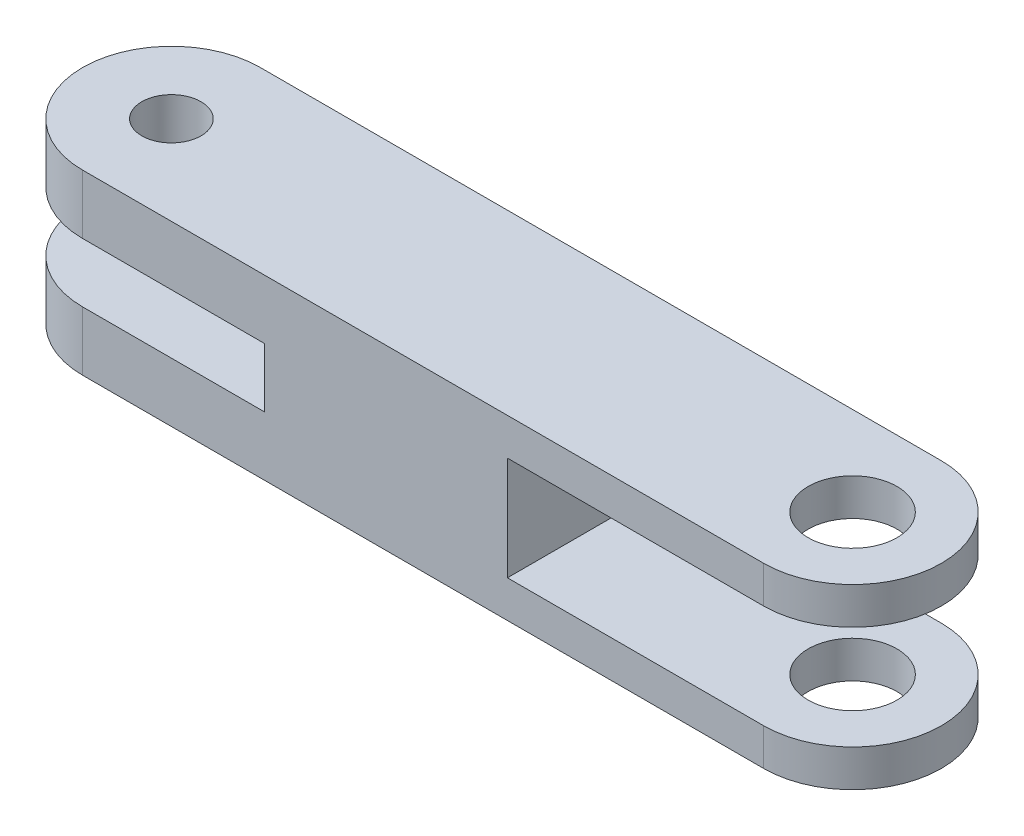
ISO-10303-21;
HEADER;
FILE_DESCRIPTION(('STEP AP214'),'2;1');
FILE_NAME('part.step','',(''),(''),'','','');
FILE_SCHEMA(('AUTOMOTIVE_DESIGN { 1 0 10303 214 1 1 1 1 }'));
ENDSEC;
DATA;
#1=APPLICATION_CONTEXT('core data for automotive mechanical design processes');
#2=APPLICATION_PROTOCOL_DEFINITION('international standard','automotive_design',2000,#1);
#3=PRODUCT_CONTEXT('',#1,'mechanical');
#4=PRODUCT('Part','Part','',(#3));
#5=PRODUCT_RELATED_PRODUCT_CATEGORY('part','',(#4));
#6=PRODUCT_DEFINITION_FORMATION('','',#4);
#7=PRODUCT_DEFINITION_CONTEXT('part definition',#1,'design');
#8=PRODUCT_DEFINITION('design','',#6,#7);
#9=PRODUCT_DEFINITION_SHAPE('','',#8);
#10=(LENGTH_UNIT() NAMED_UNIT(*) SI_UNIT(.MILLI.,.METRE.));
#11=(NAMED_UNIT(*) PLANE_ANGLE_UNIT() SI_UNIT($,.RADIAN.));
#12=(NAMED_UNIT(*) SI_UNIT($,.STERADIAN.) SOLID_ANGLE_UNIT());
#13=UNCERTAINTY_MEASURE_WITH_UNIT(LENGTH_MEASURE(1.E-05),#10,'distance_accuracy_value','');
#14=(GEOMETRIC_REPRESENTATION_CONTEXT(3) GLOBAL_UNCERTAINTY_ASSIGNED_CONTEXT((#13)) GLOBAL_UNIT_ASSIGNED_CONTEXT((#10,
#11,#12)) REPRESENTATION_CONTEXT('',''));
#15=CARTESIAN_POINT('',(0.,0.,0.));
#16=DIRECTION('',(0.,0.,1.));
#17=DIRECTION('',(1.,0.,0.));
#18=AXIS2_PLACEMENT_3D('',#15,#16,#17);
#19=CARTESIAN_POINT('',(0.,3.,0.));
#20=DIRECTION('',(0.,-1.,0.));
#21=DIRECTION('',(0.,0.,-1.));
#22=AXIS2_PLACEMENT_3D('',#19,#20,#21);
#23=CYLINDRICAL_SURFACE('',#22,3.);
#24=CARTESIAN_POINT('',(0.,1.,0.));
#25=DIRECTION('',(0.,-1.,0.));
#26=DIRECTION('',(0.,0.,-1.));
#27=AXIS2_PLACEMENT_3D('',#24,#25,#26);
#28=CIRCLE('',#27,3.);
#29=CARTESIAN_POINT('',(0.,1.,3.));
#30=VERTEX_POINT('',#29);
#31=CARTESIAN_POINT('',(0.,1.,-3.));
#32=VERTEX_POINT('',#31);
#33=EDGE_CURVE('E153',#30,#32,#28,.T.);
#34=ORIENTED_EDGE('',*,*,#33,.F.);
#35=DIRECTION('',(0.,-1.,0.));
#36=VECTOR('',#35,1.);
#37=CARTESIAN_POINT('',(0.,3.,3.));
#38=LINE('',#37,#36);
#39=CARTESIAN_POINT('',(0.,3.,3.));
#40=VERTEX_POINT('',#39);
#41=EDGE_CURVE('E148',#40,#30,#38,.T.);
#42=ORIENTED_EDGE('',*,*,#41,.F.);
#43=CARTESIAN_POINT('',(0.,3.,0.));
#44=DIRECTION('',(0.,1.,0.));
#45=DIRECTION('',(0.,0.,1.));
#46=AXIS2_PLACEMENT_3D('',#43,#44,#45);
#47=CIRCLE('',#46,3.);
#48=CARTESIAN_POINT('',(0.,3.,-3.));
#49=VERTEX_POINT('',#48);
#50=EDGE_CURVE('E200',#49,#40,#47,.T.);
#51=ORIENTED_EDGE('',*,*,#50,.F.);
#52=DIRECTION('',(0.,-1.,0.));
#53=VECTOR('',#52,1.);
#54=CARTESIAN_POINT('',(0.,3.,-3.));
#55=LINE('',#54,#53);
#56=EDGE_CURVE('E221',#49,#32,#55,.T.);
#57=ORIENTED_EDGE('',*,*,#56,.T.);
#58=EDGE_LOOP('',(#34,#42,#51,#57));
#59=FACE_BOUND('',#58,.T.);
#60=ADVANCED_FACE('F41',(#59),#23,.T.);
#61=CARTESIAN_POINT('',(0.,3.,0.));
#62=DIRECTION('',(0.,-1.,0.));
#63=DIRECTION('',(0.,0.,-1.));
#64=AXIS2_PLACEMENT_3D('',#61,#62,#63);
#65=CYLINDRICAL_SURFACE('',#64,1.);
#66=CARTESIAN_POINT('',(0.,3.,0.));
#67=DIRECTION('',(0.,1.,0.));
#68=DIRECTION('',(0.,0.,1.));
#69=AXIS2_PLACEMENT_3D('',#66,#67,#68);
#70=CIRCLE('',#69,1.);
#71=CARTESIAN_POINT('',(0.,3.,1.));
#72=VERTEX_POINT('',#71);
#73=EDGE_CURVE('E188',#72,#72,#70,.T.);
#74=ORIENTED_EDGE('',*,*,#73,.T.);
#75=EDGE_LOOP('',(#74));
#76=FACE_BOUND('',#75,.T.);
#77=CARTESIAN_POINT('',(0.,1.,0.));
#78=DIRECTION('',(0.,-1.,0.));
#79=DIRECTION('',(0.,0.,-1.));
#80=AXIS2_PLACEMENT_3D('',#77,#78,#79);
#81=CIRCLE('',#80,1.);
#82=CARTESIAN_POINT('',(0.,1.,-1.));
#83=VERTEX_POINT('',#82);
#84=EDGE_CURVE('E240',#83,#83,#81,.T.);
#85=ORIENTED_EDGE('',*,*,#84,.T.);
#86=EDGE_LOOP('',(#85));
#87=FACE_BOUND('',#86,.T.);
#88=ADVANCED_FACE('F285',(#76,#87),#65,.F.);
#89=CARTESIAN_POINT('',(0.,3.,3.));
#90=DIRECTION('',(0.,0.,-1.));
#91=DIRECTION('',(-1.,0.,0.));
#92=AXIS2_PLACEMENT_3D('',#89,#90,#91);
#93=PLANE('',#92);
#94=DIRECTION('',(0.,-1.,0.));
#95=VECTOR('',#94,1.);
#96=CARTESIAN_POINT('',(6.13903412950462,3.,3.));
#97=LINE('',#96,#95);
#98=CARTESIAN_POINT('',(6.13903412950462,1.,3.));
#99=VERTEX_POINT('',#98);
#100=CARTESIAN_POINT('',(6.13903412950462,-1.,3.));
#101=VERTEX_POINT('',#100);
#102=EDGE_CURVE('E132',#99,#101,#97,.T.);
#103=ORIENTED_EDGE('',*,*,#102,.T.);
#104=DIRECTION('',(-1.,0.,0.));
#105=VECTOR('',#104,1.);
#106=CARTESIAN_POINT('',(0.,-1.,3.));
#107=LINE('',#106,#105);
#108=CARTESIAN_POINT('',(0.,-1.,3.));
#109=VERTEX_POINT('',#108);
#110=EDGE_CURVE('E139',#101,#109,#107,.T.);
#111=ORIENTED_EDGE('',*,*,#110,.T.);
#112=CARTESIAN_POINT('',(0.,-3.,3.));
#113=VERTEX_POINT('',#112);
#114=EDGE_CURVE('E232',#109,#113,#38,.T.);
#115=ORIENTED_EDGE('',*,*,#114,.T.);
#116=DIRECTION('',(1.,0.,0.));
#117=VECTOR('',#116,1.);
#118=CARTESIAN_POINT('',(0.,-3.,3.));
#119=LINE('',#118,#117);
#120=CARTESIAN_POINT('',(23.,-3.,3.));
#121=VERTEX_POINT('',#120);
#122=EDGE_CURVE('E213',#113,#121,#119,.T.);
#123=ORIENTED_EDGE('',*,*,#122,.T.);
#124=DIRECTION('',(0.,-1.,0.));
#125=VECTOR('',#124,1.);
#126=CARTESIAN_POINT('',(23.,3.,3.));
#127=LINE('',#126,#125);
#128=CARTESIAN_POINT('',(23.,-1.75,3.));
#129=VERTEX_POINT('',#128);
#130=EDGE_CURVE('E228',#129,#121,#127,.T.);
#131=ORIENTED_EDGE('',*,*,#130,.F.);
#132=DIRECTION('',(1.,0.,0.));
#133=VECTOR('',#132,1.);
#134=CARTESIAN_POINT('',(0.,-1.75,3.));
#135=LINE('',#134,#133);
#136=CARTESIAN_POINT('',(14.3461409194115,-1.75,3.));
#137=VERTEX_POINT('',#136);
#138=EDGE_CURVE('E182',#137,#129,#135,.T.);
#139=ORIENTED_EDGE('',*,*,#138,.F.);
#140=DIRECTION('',(0.,1.,0.));
#141=VECTOR('',#140,1.);
#142=CARTESIAN_POINT('',(14.3461409194115,3.,3.));
#143=LINE('',#142,#141);
#144=CARTESIAN_POINT('',(14.3461409194115,1.75,3.));
#145=VERTEX_POINT('',#144);
#146=EDGE_CURVE('E184',#137,#145,#143,.T.);
#147=ORIENTED_EDGE('',*,*,#146,.T.);
#148=DIRECTION('',(1.,0.,0.));
#149=VECTOR('',#148,1.);
#150=CARTESIAN_POINT('',(0.,1.75,3.));
#151=LINE('',#150,#149);
#152=CARTESIAN_POINT('',(23.,1.75,3.));
#153=VERTEX_POINT('',#152);
#154=EDGE_CURVE('E174',#145,#153,#151,.T.);
#155=ORIENTED_EDGE('',*,*,#154,.T.);
#156=CARTESIAN_POINT('',(23.,3.,3.));
#157=VERTEX_POINT('',#156);
#158=EDGE_CURVE('E229',#157,#153,#127,.T.);
#159=ORIENTED_EDGE('',*,*,#158,.F.);
#160=DIRECTION('',(1.,0.,0.));
#161=VECTOR('',#160,1.);
#162=CARTESIAN_POINT('',(0.,3.,3.));
#163=LINE('',#162,#161);
#164=EDGE_CURVE('E203',#40,#157,#163,.T.);
#165=ORIENTED_EDGE('',*,*,#164,.F.);
#166=ORIENTED_EDGE('',*,*,#41,.T.);
#167=DIRECTION('',(-1.,0.,0.));
#168=VECTOR('',#167,1.);
#169=CARTESIAN_POINT('',(0.,1.,3.));
#170=LINE('',#169,#168);
#171=EDGE_CURVE('E56',#99,#30,#170,.T.);
#172=ORIENTED_EDGE('',*,*,#171,.F.);
#173=EDGE_LOOP('',(#103,#111,#115,#123,#131,#139,#147,#155,#159,#165,#166,#172));
#174=FACE_BOUND('',#173,.T.);
#175=ADVANCED_FACE('F146',(#174),#93,.F.);
#176=CARTESIAN_POINT('',(23.,3.,0.));
#177=DIRECTION('',(0.,-1.,0.));
#178=DIRECTION('',(0.,0.,-1.));
#179=AXIS2_PLACEMENT_3D('',#176,#177,#178);
#180=CYLINDRICAL_SURFACE('',#179,3.);
#181=CARTESIAN_POINT('',(23.,-1.75,0.));
#182=DIRECTION('',(0.,1.,0.));
#183=DIRECTION('',(0.,0.,1.));
#184=AXIS2_PLACEMENT_3D('',#181,#182,#183);
#185=CIRCLE('',#184,3.);
#186=CARTESIAN_POINT('',(23.,-1.75,-3.));
#187=VERTEX_POINT('',#186);
#188=EDGE_CURVE('E180',#129,#187,#185,.T.);
#189=ORIENTED_EDGE('',*,*,#188,.F.);
#190=ORIENTED_EDGE('',*,*,#130,.T.);
#191=CARTESIAN_POINT('',(23.,-3.,0.));
#192=DIRECTION('',(0.,1.,0.));
#193=DIRECTION('',(0.,0.,1.));
#194=AXIS2_PLACEMENT_3D('',#191,#192,#193);
#195=CIRCLE('',#194,3.);
#196=CARTESIAN_POINT('',(23.,-3.,-3.));
#197=VERTEX_POINT('',#196);
#198=EDGE_CURVE('E216',#121,#197,#195,.T.);
#199=ORIENTED_EDGE('',*,*,#198,.T.);
#200=DIRECTION('',(0.,-1.,0.));
#201=VECTOR('',#200,1.);
#202=CARTESIAN_POINT('',(23.,3.,-3.));
#203=LINE('',#202,#201);
#204=EDGE_CURVE('E224',#187,#197,#203,.T.);
#205=ORIENTED_EDGE('',*,*,#204,.F.);
#206=EDGE_LOOP('',(#189,#190,#199,#205));
#207=FACE_BOUND('',#206,.T.);
#208=ADVANCED_FACE('F263',(#207),#180,.T.);
#209=CARTESIAN_POINT('',(0.,3.,-3.));
#210=DIRECTION('',(0.,0.,1.));
#211=DIRECTION('',(1.,0.,0.));
#212=AXIS2_PLACEMENT_3D('',#209,#210,#211);
#213=PLANE('',#212);
#214=CARTESIAN_POINT('',(0.,-1.,-3.));
#215=VERTEX_POINT('',#214);
#216=CARTESIAN_POINT('',(0.,-3.,-3.));
#217=VERTEX_POINT('',#216);
#218=EDGE_CURVE('E210',#215,#217,#55,.T.);
#219=ORIENTED_EDGE('',*,*,#218,.F.);
#220=DIRECTION('',(1.,0.,0.));
#221=VECTOR('',#220,1.);
#222=CARTESIAN_POINT('',(0.,-1.,-3.));
#223=LINE('',#222,#221);
#224=CARTESIAN_POINT('',(6.13903412950462,-1.,-3.));
#225=VERTEX_POINT('',#224);
#226=EDGE_CURVE('E159',#215,#225,#223,.T.);
#227=ORIENTED_EDGE('',*,*,#226,.T.);
#228=DIRECTION('',(0.,1.,0.));
#229=VECTOR('',#228,1.);
#230=CARTESIAN_POINT('',(6.13903412950462,3.,-3.));
#231=LINE('',#230,#229);
#232=CARTESIAN_POINT('',(6.13903412950462,1.,-3.));
#233=VERTEX_POINT('',#232);
#234=EDGE_CURVE('E11',#225,#233,#231,.T.);
#235=ORIENTED_EDGE('',*,*,#234,.T.);
#236=DIRECTION('',(1.,0.,0.));
#237=VECTOR('',#236,1.);
#238=CARTESIAN_POINT('',(0.,1.,-3.));
#239=LINE('',#238,#237);
#240=EDGE_CURVE('E143',#32,#233,#239,.T.);
#241=ORIENTED_EDGE('',*,*,#240,.F.);
#242=ORIENTED_EDGE('',*,*,#56,.F.);
#243=DIRECTION('',(-1.,0.,0.));
#244=VECTOR('',#243,1.);
#245=CARTESIAN_POINT('',(0.,3.,-3.));
#246=LINE('',#245,#244);
#247=CARTESIAN_POINT('',(23.,3.,-3.));
#248=VERTEX_POINT('',#247);
#249=EDGE_CURVE('E208',#248,#49,#246,.T.);
#250=ORIENTED_EDGE('',*,*,#249,.F.);
#251=CARTESIAN_POINT('',(23.,1.75,-3.));
#252=VERTEX_POINT('',#251);
#253=EDGE_CURVE('E225',#248,#252,#203,.T.);
#254=ORIENTED_EDGE('',*,*,#253,.T.);
#255=DIRECTION('',(-1.,0.,0.));
#256=VECTOR('',#255,1.);
#257=CARTESIAN_POINT('',(0.,1.75,-3.));
#258=LINE('',#257,#256);
#259=CARTESIAN_POINT('',(14.3461409194115,1.75,-3.));
#260=VERTEX_POINT('',#259);
#261=EDGE_CURVE('E168',#252,#260,#258,.T.);
#262=ORIENTED_EDGE('',*,*,#261,.T.);
#263=DIRECTION('',(0.,-1.,0.));
#264=VECTOR('',#263,1.);
#265=CARTESIAN_POINT('',(14.3461409194115,3.,-3.));
#266=LINE('',#265,#264);
#267=CARTESIAN_POINT('',(14.3461409194115,-1.75,-3.));
#268=VERTEX_POINT('',#267);
#269=EDGE_CURVE('E49',#260,#268,#266,.T.);
#270=ORIENTED_EDGE('',*,*,#269,.T.);
#271=DIRECTION('',(-1.,0.,0.));
#272=VECTOR('',#271,1.);
#273=CARTESIAN_POINT('',(0.,-1.75,-3.));
#274=LINE('',#273,#272);
#275=EDGE_CURVE('E178',#187,#268,#274,.T.);
#276=ORIENTED_EDGE('',*,*,#275,.F.);
#277=ORIENTED_EDGE('',*,*,#204,.T.);
#278=DIRECTION('',(-1.,0.,0.));
#279=VECTOR('',#278,1.);
#280=CARTESIAN_POINT('',(0.,-3.,-3.));
#281=LINE('',#280,#279);
#282=EDGE_CURVE('E204',#197,#217,#281,.T.);
#283=ORIENTED_EDGE('',*,*,#282,.T.);
#284=EDGE_LOOP('',(#219,#227,#235,#241,#242,#250,#254,#262,#270,#276,#277,#283));
#285=FACE_BOUND('',#284,.T.);
#286=ADVANCED_FACE('F249',(#285),#213,.F.);
#287=CARTESIAN_POINT('',(23.,3.,0.));
#288=DIRECTION('',(0.,-1.,0.));
#289=DIRECTION('',(0.,0.,-1.));
#290=AXIS2_PLACEMENT_3D('',#287,#288,#289);
#291=CYLINDRICAL_SURFACE('',#290,1.5);
#292=CARTESIAN_POINT('',(23.,-3.,0.));
#293=DIRECTION('',(0.,1.,0.));
#294=DIRECTION('',(0.,0.,1.));
#295=AXIS2_PLACEMENT_3D('',#292,#293,#294);
#296=CIRCLE('',#295,1.5);
#297=CARTESIAN_POINT('',(23.,-3.,1.5));
#298=VERTEX_POINT('',#297);
#299=EDGE_CURVE('E191',#298,#298,#296,.T.);
#300=ORIENTED_EDGE('',*,*,#299,.F.);
#301=EDGE_LOOP('',(#300));
#302=FACE_BOUND('',#301,.T.);
#303=CARTESIAN_POINT('',(23.,-1.75,0.));
#304=DIRECTION('',(0.,1.,0.));
#305=DIRECTION('',(0.,0.,1.));
#306=AXIS2_PLACEMENT_3D('',#303,#304,#305);
#307=CIRCLE('',#306,1.5);
#308=CARTESIAN_POINT('',(23.,-1.75,1.5));
#309=VERTEX_POINT('',#308);
#310=EDGE_CURVE('E177',#309,#309,#307,.T.);
#311=ORIENTED_EDGE('',*,*,#310,.T.);
#312=EDGE_LOOP('',(#311));
#313=FACE_BOUND('',#312,.T.);
#314=ADVANCED_FACE('F307',(#302,#313),#291,.F.);
#315=CARTESIAN_POINT('',(0.,3.,0.));
#316=DIRECTION('',(0.,1.,0.));
#317=DIRECTION('',(0.,0.,1.));
#318=AXIS2_PLACEMENT_3D('',#315,#316,#317);
#319=PLANE('',#318);
#320=CARTESIAN_POINT('',(23.,3.,0.));
#321=DIRECTION('',(0.,1.,0.));
#322=DIRECTION('',(0.,0.,1.));
#323=AXIS2_PLACEMENT_3D('',#320,#321,#322);
#324=CIRCLE('',#323,1.5);
#325=CARTESIAN_POINT('',(23.,3.,1.5));
#326=VERTEX_POINT('',#325);
#327=EDGE_CURVE('E194',#326,#326,#324,.T.);
#328=ORIENTED_EDGE('',*,*,#327,.F.);
#329=EDGE_LOOP('',(#328));
#330=FACE_BOUND('',#329,.T.);
#331=ORIENTED_EDGE('',*,*,#50,.T.);
#332=ORIENTED_EDGE('',*,*,#164,.T.);
#333=CARTESIAN_POINT('',(23.,3.,0.));
#334=DIRECTION('',(0.,1.,0.));
#335=DIRECTION('',(0.,0.,1.));
#336=AXIS2_PLACEMENT_3D('',#333,#334,#335);
#337=CIRCLE('',#336,3.);
#338=EDGE_CURVE('E206',#157,#248,#337,.T.);
#339=ORIENTED_EDGE('',*,*,#338,.T.);
#340=ORIENTED_EDGE('',*,*,#249,.T.);
#341=EDGE_LOOP('',(#331,#332,#339,#340));
#342=FACE_BOUND('',#341,.T.);
#343=ORIENTED_EDGE('',*,*,#73,.F.);
#344=EDGE_LOOP('',(#343));
#345=FACE_BOUND('',#344,.T.);
#346=ADVANCED_FACE('F280',(#330,#342,#345),#319,.T.);
#347=CARTESIAN_POINT('',(0.,-3.,0.));
#348=DIRECTION('',(0.,1.,0.));
#349=DIRECTION('',(0.,0.,1.));
#350=AXIS2_PLACEMENT_3D('',#347,#348,#349);
#351=PLANE('',#350);
#352=CARTESIAN_POINT('',(0.,-3.,0.));
#353=DIRECTION('',(0.,1.,0.));
#354=DIRECTION('',(0.,0.,1.));
#355=AXIS2_PLACEMENT_3D('',#352,#353,#354);
#356=CIRCLE('',#355,3.);
#357=EDGE_CURVE('E197',#217,#113,#356,.T.);
#358=ORIENTED_EDGE('',*,*,#357,.F.);
#359=ORIENTED_EDGE('',*,*,#282,.F.);
#360=ORIENTED_EDGE('',*,*,#198,.F.);
#361=ORIENTED_EDGE('',*,*,#122,.F.);
#362=EDGE_LOOP('',(#358,#359,#360,#361));
#363=FACE_BOUND('',#362,.T.);
#364=ORIENTED_EDGE('',*,*,#299,.T.);
#365=EDGE_LOOP('',(#364));
#366=FACE_BOUND('',#365,.T.);
#367=CARTESIAN_POINT('',(0.,-3.,0.));
#368=DIRECTION('',(0.,1.,0.));
#369=DIRECTION('',(0.,0.,1.));
#370=AXIS2_PLACEMENT_3D('',#367,#368,#369);
#371=CIRCLE('',#370,1.);
#372=CARTESIAN_POINT('',(0.,-3.,1.));
#373=VERTEX_POINT('',#372);
#374=EDGE_CURVE('E187',#373,#373,#371,.T.);
#375=ORIENTED_EDGE('',*,*,#374,.T.);
#376=EDGE_LOOP('',(#375));
#377=FACE_BOUND('',#376,.T.);
#378=ADVANCED_FACE('F258',(#363,#366,#377),#351,.F.);
#379=ORIENTED_EDGE('',*,*,#114,.F.);
#380=CARTESIAN_POINT('',(0.,-1.,0.));
#381=DIRECTION('',(0.,-1.,0.));
#382=DIRECTION('',(0.,0.,-1.));
#383=AXIS2_PLACEMENT_3D('',#380,#381,#382);
#384=CIRCLE('',#383,3.);
#385=EDGE_CURVE('E152',#109,#215,#384,.T.);
#386=ORIENTED_EDGE('',*,*,#385,.T.);
#387=ORIENTED_EDGE('',*,*,#218,.T.);
#388=ORIENTED_EDGE('',*,*,#357,.T.);
#389=EDGE_LOOP('',(#379,#386,#387,#388));
#390=FACE_BOUND('',#389,.T.);
#391=ADVANCED_FACE('F43',(#390),#23,.T.);
#392=ORIENTED_EDGE('',*,*,#158,.T.);
#393=CARTESIAN_POINT('',(23.,1.75,0.));
#394=DIRECTION('',(0.,1.,0.));
#395=DIRECTION('',(0.,0.,1.));
#396=AXIS2_PLACEMENT_3D('',#393,#394,#395);
#397=CIRCLE('',#396,3.);
#398=EDGE_CURVE('E171',#153,#252,#397,.T.);
#399=ORIENTED_EDGE('',*,*,#398,.T.);
#400=ORIENTED_EDGE('',*,*,#253,.F.);
#401=ORIENTED_EDGE('',*,*,#338,.F.);
#402=EDGE_LOOP('',(#392,#399,#400,#401));
#403=FACE_BOUND('',#402,.T.);
#404=ADVANCED_FACE('F275',(#403),#180,.T.);
#405=CARTESIAN_POINT('',(23.,1.75,0.));
#406=DIRECTION('',(0.,1.,0.));
#407=DIRECTION('',(0.,0.,1.));
#408=AXIS2_PLACEMENT_3D('',#405,#406,#407);
#409=CIRCLE('',#408,1.5);
#410=CARTESIAN_POINT('',(23.,1.75,1.5));
#411=VERTEX_POINT('',#410);
#412=EDGE_CURVE('E166',#411,#411,#409,.T.);
#413=ORIENTED_EDGE('',*,*,#412,.F.);
#414=EDGE_LOOP('',(#413));
#415=FACE_BOUND('',#414,.T.);
#416=ORIENTED_EDGE('',*,*,#327,.T.);
#417=EDGE_LOOP('',(#416));
#418=FACE_BOUND('',#417,.T.);
#419=ADVANCED_FACE('F299',(#415,#418),#291,.F.);
#420=CARTESIAN_POINT('',(0.,-1.,0.));
#421=DIRECTION('',(0.,-1.,0.));
#422=DIRECTION('',(0.,0.,-1.));
#423=AXIS2_PLACEMENT_3D('',#420,#421,#422);
#424=CIRCLE('',#423,1.);
#425=CARTESIAN_POINT('',(0.,-1.,-1.));
#426=VERTEX_POINT('',#425);
#427=EDGE_CURVE('E149',#426,#426,#424,.T.);
#428=ORIENTED_EDGE('',*,*,#427,.F.);
#429=EDGE_LOOP('',(#428));
#430=FACE_BOUND('',#429,.T.);
#431=ORIENTED_EDGE('',*,*,#374,.F.);
#432=EDGE_LOOP('',(#431));
#433=FACE_BOUND('',#432,.T.);
#434=ADVANCED_FACE('F292',(#430,#433),#65,.F.);
#435=CARTESIAN_POINT('',(14.3461409194115,-1.75,-7.84320747138726));
#436=DIRECTION('',(-1.,0.,0.));
#437=DIRECTION('',(0.,0.,1.));
#438=AXIS2_PLACEMENT_3D('',#435,#436,#437);
#439=PLANE('',#438);
#440=DIRECTION('',(0.,0.,1.));
#441=VECTOR('',#440,1.);
#442=CARTESIAN_POINT('',(14.3461409194115,-1.75,-7.84320747138726));
#443=LINE('',#442,#441);
#444=EDGE_CURVE('E163',#268,#137,#443,.T.);
#445=ORIENTED_EDGE('',*,*,#444,.F.);
#446=ORIENTED_EDGE('',*,*,#269,.F.);
#447=DIRECTION('',(0.,0.,1.));
#448=VECTOR('',#447,1.);
#449=CARTESIAN_POINT('',(14.3461409194115,1.75,-7.84320747138726));
#450=LINE('',#449,#448);
#451=EDGE_CURVE('E64',#260,#145,#450,.T.);
#452=ORIENTED_EDGE('',*,*,#451,.T.);
#453=ORIENTED_EDGE('',*,*,#146,.F.);
#454=EDGE_LOOP('',(#445,#446,#452,#453));
#455=FACE_BOUND('',#454,.T.);
#456=ADVANCED_FACE('F270',(#455),#439,.F.);
#457=CARTESIAN_POINT('',(0.,-1.75,0.));
#458=DIRECTION('',(0.,1.,0.));
#459=DIRECTION('',(0.,0.,1.));
#460=AXIS2_PLACEMENT_3D('',#457,#458,#459);
#461=PLANE('',#460);
#462=ORIENTED_EDGE('',*,*,#310,.F.);
#463=EDGE_LOOP('',(#462));
#464=FACE_BOUND('',#463,.T.);
#465=ORIENTED_EDGE('',*,*,#138,.T.);
#466=ORIENTED_EDGE('',*,*,#188,.T.);
#467=ORIENTED_EDGE('',*,*,#275,.T.);
#468=ORIENTED_EDGE('',*,*,#444,.T.);
#469=EDGE_LOOP('',(#465,#466,#467,#468));
#470=FACE_BOUND('',#469,.T.);
#471=ADVANCED_FACE('F266',(#464,#470),#461,.T.);
#472=CARTESIAN_POINT('',(0.,1.75,0.));
#473=DIRECTION('',(0.,1.,0.));
#474=DIRECTION('',(0.,0.,1.));
#475=AXIS2_PLACEMENT_3D('',#472,#473,#474);
#476=PLANE('',#475);
#477=ORIENTED_EDGE('',*,*,#412,.T.);
#478=EDGE_LOOP('',(#477));
#479=FACE_BOUND('',#478,.T.);
#480=ORIENTED_EDGE('',*,*,#451,.F.);
#481=ORIENTED_EDGE('',*,*,#261,.F.);
#482=ORIENTED_EDGE('',*,*,#398,.F.);
#483=ORIENTED_EDGE('',*,*,#154,.F.);
#484=EDGE_LOOP('',(#480,#481,#482,#483));
#485=FACE_BOUND('',#484,.T.);
#486=ADVANCED_FACE('F273',(#479,#485),#476,.F.);
#487=CARTESIAN_POINT('',(6.13903412950462,-1.,-5.03584344586886));
#488=DIRECTION('',(1.,0.,0.));
#489=DIRECTION('',(0.,0.,-1.));
#490=AXIS2_PLACEMENT_3D('',#487,#488,#489);
#491=PLANE('',#490);
#492=DIRECTION('',(0.,0.,-1.));
#493=VECTOR('',#492,1.);
#494=CARTESIAN_POINT('',(6.13903412950462,1.,-5.03584344586886));
#495=LINE('',#494,#493);
#496=EDGE_CURVE('E134',#99,#233,#495,.T.);
#497=ORIENTED_EDGE('',*,*,#496,.T.);
#498=ORIENTED_EDGE('',*,*,#234,.F.);
#499=DIRECTION('',(0.,0.,-1.));
#500=VECTOR('',#499,1.);
#501=CARTESIAN_POINT('',(6.13903412950462,-1.,-5.03584344586886));
#502=LINE('',#501,#500);
#503=EDGE_CURVE('E136',#101,#225,#502,.T.);
#504=ORIENTED_EDGE('',*,*,#503,.F.);
#505=ORIENTED_EDGE('',*,*,#102,.F.);
#506=EDGE_LOOP('',(#497,#498,#504,#505));
#507=FACE_BOUND('',#506,.T.);
#508=ADVANCED_FACE('F133',(#507),#491,.F.);
#509=CARTESIAN_POINT('',(0.,-1.,0.));
#510=DIRECTION('',(0.,-1.,0.));
#511=DIRECTION('',(0.,0.,-1.));
#512=AXIS2_PLACEMENT_3D('',#509,#510,#511);
#513=PLANE('',#512);
#514=ORIENTED_EDGE('',*,*,#427,.T.);
#515=EDGE_LOOP('',(#514));
#516=FACE_BOUND('',#515,.T.);
#517=ORIENTED_EDGE('',*,*,#503,.T.);
#518=ORIENTED_EDGE('',*,*,#226,.F.);
#519=ORIENTED_EDGE('',*,*,#385,.F.);
#520=ORIENTED_EDGE('',*,*,#110,.F.);
#521=EDGE_LOOP('',(#517,#518,#519,#520));
#522=FACE_BOUND('',#521,.T.);
#523=ADVANCED_FACE('F246',(#516,#522),#513,.F.);
#524=CARTESIAN_POINT('',(0.,1.,0.));
#525=DIRECTION('',(0.,-1.,0.));
#526=DIRECTION('',(0.,0.,-1.));
#527=AXIS2_PLACEMENT_3D('',#524,#525,#526);
#528=PLANE('',#527);
#529=ORIENTED_EDGE('',*,*,#84,.F.);
#530=EDGE_LOOP('',(#529));
#531=FACE_BOUND('',#530,.T.);
#532=ORIENTED_EDGE('',*,*,#171,.T.);
#533=ORIENTED_EDGE('',*,*,#33,.T.);
#534=ORIENTED_EDGE('',*,*,#240,.T.);
#535=ORIENTED_EDGE('',*,*,#496,.F.);
#536=EDGE_LOOP('',(#532,#533,#534,#535));
#537=FACE_BOUND('',#536,.T.);
#538=ADVANCED_FACE('F141',(#531,#537),#528,.T.);
#539=CLOSED_SHELL('',(#60,#88,#175,#208,#286,#314,#346,#378,#391,#404,#419,#434,#456,#471,#486,
#508,#523,#538));
#540=MANIFOLD_SOLID_BREP('B2',#539);
#541=ADVANCED_BREP_SHAPE_REPRESENTATION('',(#18,#540),#14);
#542=SHAPE_DEFINITION_REPRESENTATION(#9,#541);
ENDSEC;
END-ISO-10303-21;
